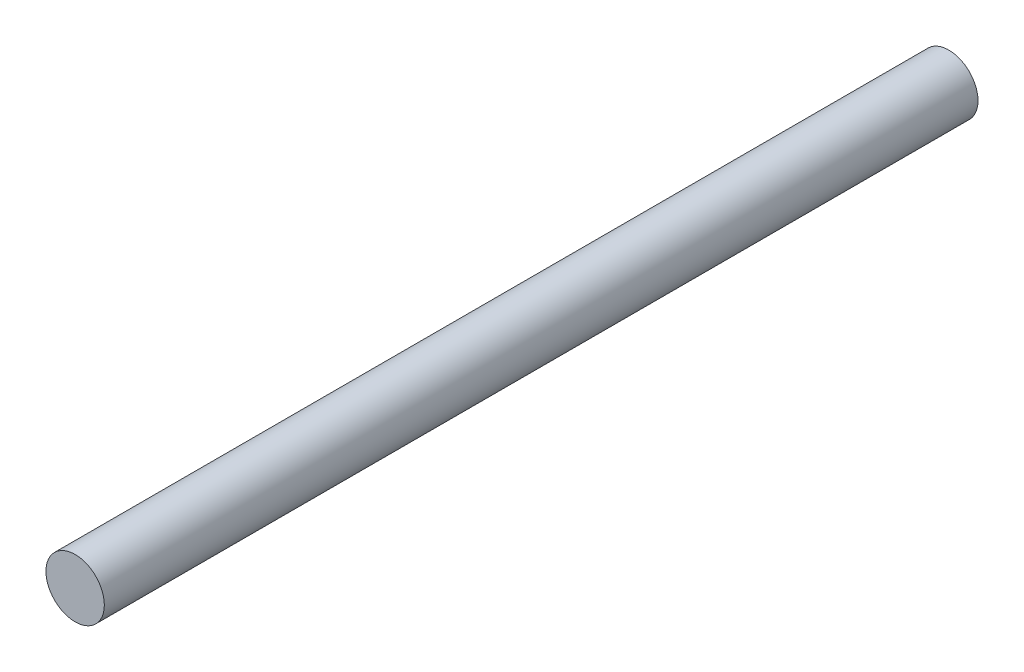
ISO-10303-21;
HEADER;
FILE_DESCRIPTION(('STEP AP214'),'2;1');
FILE_NAME('part.step','',(''),(''),'','','');
FILE_SCHEMA(('AUTOMOTIVE_DESIGN { 1 0 10303 214 1 1 1 1 }'));
ENDSEC;
DATA;
#1=APPLICATION_CONTEXT('core data for automotive mechanical design processes');
#2=APPLICATION_PROTOCOL_DEFINITION('international standard','automotive_design',2000,#1);
#3=PRODUCT_CONTEXT('',#1,'mechanical');
#4=PRODUCT('Part','Part','',(#3));
#5=PRODUCT_RELATED_PRODUCT_CATEGORY('part','',(#4));
#6=PRODUCT_DEFINITION_FORMATION('','',#4);
#7=PRODUCT_DEFINITION_CONTEXT('part definition',#1,'design');
#8=PRODUCT_DEFINITION('design','',#6,#7);
#9=PRODUCT_DEFINITION_SHAPE('','',#8);
#10=(LENGTH_UNIT() NAMED_UNIT(*) SI_UNIT(.MILLI.,.METRE.));
#11=(NAMED_UNIT(*) PLANE_ANGLE_UNIT() SI_UNIT($,.RADIAN.));
#12=(NAMED_UNIT(*) SI_UNIT($,.STERADIAN.) SOLID_ANGLE_UNIT());
#13=UNCERTAINTY_MEASURE_WITH_UNIT(LENGTH_MEASURE(1.E-05),#10,'distance_accuracy_value','');
#14=(GEOMETRIC_REPRESENTATION_CONTEXT(3) GLOBAL_UNCERTAINTY_ASSIGNED_CONTEXT((#13)) GLOBAL_UNIT_ASSIGNED_CONTEXT((#10,
#11,#12)) REPRESENTATION_CONTEXT('',''));
#15=CARTESIAN_POINT('',(0.,0.,0.));
#16=DIRECTION('',(0.,0.,1.));
#17=DIRECTION('',(1.,0.,0.));
#18=AXIS2_PLACEMENT_3D('',#15,#16,#17);
#19=CARTESIAN_POINT('',(0.,0.,-190.));
#20=DIRECTION('',(0.,0.,1.));
#21=DIRECTION('',(1.,0.,0.));
#22=AXIS2_PLACEMENT_3D('',#19,#20,#21);
#23=CYLINDRICAL_SURFACE('',#22,6.35);
#24=CARTESIAN_POINT('',(0.,0.,-190.));
#25=DIRECTION('',(0.,0.,1.));
#26=DIRECTION('',(1.,0.,0.));
#27=AXIS2_PLACEMENT_3D('',#24,#25,#26);
#28=CIRCLE('',#27,6.35);
#29=CARTESIAN_POINT('',(6.35,0.,-190.));
#30=VERTEX_POINT('',#29);
#31=EDGE_CURVE('E10',#30,#30,#28,.T.);
#32=ORIENTED_EDGE('',*,*,#31,.T.);
#33=EDGE_LOOP('',(#32));
#34=FACE_BOUND('',#33,.T.);
#35=CARTESIAN_POINT('',(0.,0.,0.));
#36=DIRECTION('',(0.,0.,1.));
#37=DIRECTION('',(1.,0.,0.));
#38=AXIS2_PLACEMENT_3D('',#35,#36,#37);
#39=CIRCLE('',#38,6.35);
#40=CARTESIAN_POINT('',(6.35,0.,0.));
#41=VERTEX_POINT('',#40);
#42=EDGE_CURVE('E34',#41,#41,#39,.T.);
#43=ORIENTED_EDGE('',*,*,#42,.F.);
#44=EDGE_LOOP('',(#43));
#45=FACE_BOUND('',#44,.T.);
#46=ADVANCED_FACE('F31',(#34,#45),#23,.T.);
#47=CARTESIAN_POINT('',(0.,0.,-190.));
#48=DIRECTION('',(0.,0.,1.));
#49=DIRECTION('',(1.,0.,0.));
#50=AXIS2_PLACEMENT_3D('',#47,#48,#49);
#51=PLANE('',#50);
#52=ORIENTED_EDGE('',*,*,#31,.F.);
#53=EDGE_LOOP('',(#52));
#54=FACE_BOUND('',#53,.T.);
#55=ADVANCED_FACE('F46',(#54),#51,.F.);
#56=CARTESIAN_POINT('',(0.,0.,0.));
#57=DIRECTION('',(0.,0.,1.));
#58=DIRECTION('',(1.,0.,0.));
#59=AXIS2_PLACEMENT_3D('',#56,#57,#58);
#60=PLANE('',#59);
#61=ORIENTED_EDGE('',*,*,#42,.T.);
#62=EDGE_LOOP('',(#61));
#63=FACE_BOUND('',#62,.T.);
#64=ADVANCED_FACE('F43',(#63),#60,.T.);
#65=CLOSED_SHELL('',(#46,#55,#64));
#66=MANIFOLD_SOLID_BREP('B2',#65);
#67=ADVANCED_BREP_SHAPE_REPRESENTATION('',(#18,#66),#14);
#68=SHAPE_DEFINITION_REPRESENTATION(#9,#67);
ENDSEC;
END-ISO-10303-21;
